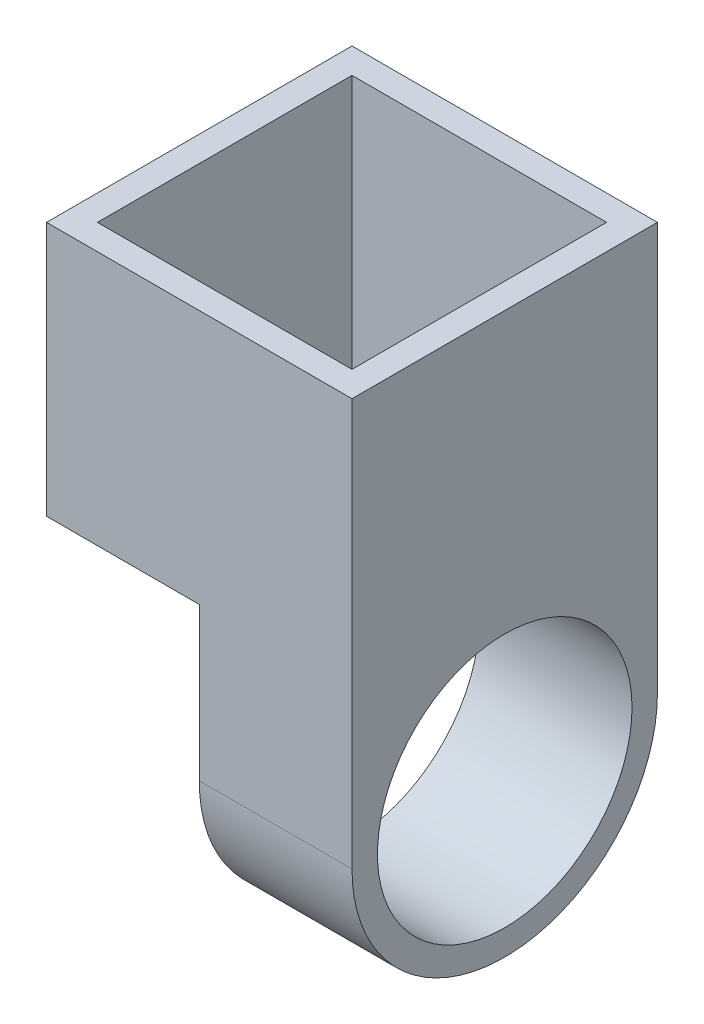
ISO-10303-21;
HEADER;
FILE_DESCRIPTION(('STEP AP214'),'2;1');
FILE_NAME('part.step','',(''),(''),'','','');
FILE_SCHEMA(('AUTOMOTIVE_DESIGN { 1 0 10303 214 1 1 1 1 }'));
ENDSEC;
DATA;
#1=APPLICATION_CONTEXT('core data for automotive mechanical design processes');
#2=APPLICATION_PROTOCOL_DEFINITION('international standard','automotive_design',2000,#1);
#3=PRODUCT_CONTEXT('',#1,'mechanical');
#4=PRODUCT('Part','Part','',(#3));
#5=PRODUCT_RELATED_PRODUCT_CATEGORY('part','',(#4));
#6=PRODUCT_DEFINITION_FORMATION('','',#4);
#7=PRODUCT_DEFINITION_CONTEXT('part definition',#1,'design');
#8=PRODUCT_DEFINITION('design','',#6,#7);
#9=PRODUCT_DEFINITION_SHAPE('','',#8);
#10=(LENGTH_UNIT() NAMED_UNIT(*) SI_UNIT(.MILLI.,.METRE.));
#11=(NAMED_UNIT(*) PLANE_ANGLE_UNIT() SI_UNIT($,.RADIAN.));
#12=(NAMED_UNIT(*) SI_UNIT($,.STERADIAN.) SOLID_ANGLE_UNIT());
#13=UNCERTAINTY_MEASURE_WITH_UNIT(LENGTH_MEASURE(1.E-05),#10,'distance_accuracy_value','');
#14=(GEOMETRIC_REPRESENTATION_CONTEXT(3) GLOBAL_UNCERTAINTY_ASSIGNED_CONTEXT((#13)) GLOBAL_UNIT_ASSIGNED_CONTEXT((#10,
#11,#12)) REPRESENTATION_CONTEXT('',''));
#15=CARTESIAN_POINT('',(0.,0.,0.));
#16=DIRECTION('',(0.,0.,1.));
#17=DIRECTION('',(1.,0.,0.));
#18=AXIS2_PLACEMENT_3D('',#15,#16,#17);
#19=CARTESIAN_POINT('',(0.,0.,0.));
#20=DIRECTION('',(0.,1.,0.));
#21=DIRECTION('',(0.,0.,1.));
#22=AXIS2_PLACEMENT_3D('',#19,#20,#21);
#23=PLANE('',#22);
#24=DIRECTION('',(0.,0.,-1.));
#25=VECTOR('',#24,1.);
#26=CARTESIAN_POINT('',(0.,0.,0.));
#27=LINE('',#26,#25);
#28=CARTESIAN_POINT('',(0.,0.,6.));
#29=VERTEX_POINT('',#28);
#30=CARTESIAN_POINT('',(0.,0.,5.));
#31=VERTEX_POINT('',#30);
#32=EDGE_CURVE('E50',#29,#31,#27,.T.);
#33=ORIENTED_EDGE('',*,*,#32,.F.);
#34=DIRECTION('',(1.,0.,0.));
#35=VECTOR('',#34,1.);
#36=CARTESIAN_POINT('',(-6.,0.,6.));
#37=LINE('',#36,#35);
#38=CARTESIAN_POINT('',(-6.,0.,6.));
#39=VERTEX_POINT('',#38);
#40=EDGE_CURVE('E195',#39,#29,#37,.T.);
#41=ORIENTED_EDGE('',*,*,#40,.F.);
#42=DIRECTION('',(0.,0.,1.));
#43=VECTOR('',#42,1.);
#44=CARTESIAN_POINT('',(-6.,0.,-6.));
#45=LINE('',#44,#43);
#46=CARTESIAN_POINT('',(-6.,0.,-6.));
#47=VERTEX_POINT('',#46);
#48=EDGE_CURVE('E203',#47,#39,#45,.T.);
#49=ORIENTED_EDGE('',*,*,#48,.F.);
#50=DIRECTION('',(-1.,0.,0.));
#51=VECTOR('',#50,1.);
#52=CARTESIAN_POINT('',(-6.,0.,-6.));
#53=LINE('',#52,#51);
#54=CARTESIAN_POINT('',(0.,0.,-6.));
#55=VERTEX_POINT('',#54);
#56=EDGE_CURVE('E190',#55,#47,#53,.T.);
#57=ORIENTED_EDGE('',*,*,#56,.F.);
#58=CARTESIAN_POINT('',(0.,0.,-5.));
#59=VERTEX_POINT('',#58);
#60=EDGE_CURVE('E11',#59,#55,#27,.T.);
#61=ORIENTED_EDGE('',*,*,#60,.F.);
#62=DIRECTION('',(-1.,0.,0.));
#63=VECTOR('',#62,1.);
#64=CARTESIAN_POINT('',(-5.,0.,-5.));
#65=LINE('',#64,#63);
#66=CARTESIAN_POINT('',(-5.,0.,-5.));
#67=VERTEX_POINT('',#66);
#68=EDGE_CURVE('E173',#59,#67,#65,.T.);
#69=ORIENTED_EDGE('',*,*,#68,.T.);
#70=DIRECTION('',(0.,0.,1.));
#71=VECTOR('',#70,1.);
#72=CARTESIAN_POINT('',(-5.,0.,-5.));
#73=LINE('',#72,#71);
#74=CARTESIAN_POINT('',(-5.,0.,5.));
#75=VERTEX_POINT('',#74);
#76=EDGE_CURVE('E177',#67,#75,#73,.T.);
#77=ORIENTED_EDGE('',*,*,#76,.T.);
#78=DIRECTION('',(1.,0.,0.));
#79=VECTOR('',#78,1.);
#80=CARTESIAN_POINT('',(-5.,0.,5.));
#81=LINE('',#80,#79);
#82=EDGE_CURVE('E163',#75,#31,#81,.T.);
#83=ORIENTED_EDGE('',*,*,#82,.T.);
#84=EDGE_LOOP('',(#33,#41,#49,#57,#61,#69,#77,#83));
#85=FACE_BOUND('',#84,.T.);
#86=ADVANCED_FACE('F40',(#85),#23,.F.);
#87=CARTESIAN_POINT('',(0.,10.,0.));
#88=DIRECTION('',(0.,1.,0.));
#89=DIRECTION('',(0.,0.,1.));
#90=AXIS2_PLACEMENT_3D('',#87,#88,#89);
#91=PLANE('',#90);
#92=DIRECTION('',(0.,0.,-1.));
#93=VECTOR('',#92,1.);
#94=CARTESIAN_POINT('',(6.,10.,-6.));
#95=LINE('',#94,#93);
#96=CARTESIAN_POINT('',(6.,10.,6.));
#97=VERTEX_POINT('',#96);
#98=CARTESIAN_POINT('',(6.,10.,-6.));
#99=VERTEX_POINT('',#98);
#100=EDGE_CURVE('E191',#97,#99,#95,.T.);
#101=ORIENTED_EDGE('',*,*,#100,.T.);
#102=DIRECTION('',(-1.,0.,0.));
#103=VECTOR('',#102,1.);
#104=CARTESIAN_POINT('',(-6.,10.,-6.));
#105=LINE('',#104,#103);
#106=CARTESIAN_POINT('',(-6.,10.,-6.));
#107=VERTEX_POINT('',#106);
#108=EDGE_CURVE('E194',#99,#107,#105,.T.);
#109=ORIENTED_EDGE('',*,*,#108,.T.);
#110=DIRECTION('',(0.,0.,1.));
#111=VECTOR('',#110,1.);
#112=CARTESIAN_POINT('',(-6.,10.,-6.));
#113=LINE('',#112,#111);
#114=CARTESIAN_POINT('',(-6.,10.,6.));
#115=VERTEX_POINT('',#114);
#116=EDGE_CURVE('E197',#107,#115,#113,.T.);
#117=ORIENTED_EDGE('',*,*,#116,.T.);
#118=DIRECTION('',(1.,0.,0.));
#119=VECTOR('',#118,1.);
#120=CARTESIAN_POINT('',(-6.,10.,6.));
#121=LINE('',#120,#119);
#122=EDGE_CURVE('E199',#115,#97,#121,.T.);
#123=ORIENTED_EDGE('',*,*,#122,.T.);
#124=EDGE_LOOP('',(#101,#109,#117,#123));
#125=FACE_BOUND('',#124,.T.);
#126=DIRECTION('',(-1.,0.,0.));
#127=VECTOR('',#126,1.);
#128=CARTESIAN_POINT('',(-5.,10.,-5.));
#129=LINE('',#128,#127);
#130=CARTESIAN_POINT('',(5.,10.,-5.));
#131=VERTEX_POINT('',#130);
#132=CARTESIAN_POINT('',(-5.,10.,-5.));
#133=VERTEX_POINT('',#132);
#134=EDGE_CURVE('E162',#131,#133,#129,.T.);
#135=ORIENTED_EDGE('',*,*,#134,.F.);
#136=DIRECTION('',(0.,0.,-1.));
#137=VECTOR('',#136,1.);
#138=CARTESIAN_POINT('',(5.,10.,-5.));
#139=LINE('',#138,#137);
#140=CARTESIAN_POINT('',(5.,10.,5.));
#141=VERTEX_POINT('',#140);
#142=EDGE_CURVE('E160',#141,#131,#139,.T.);
#143=ORIENTED_EDGE('',*,*,#142,.F.);
#144=DIRECTION('',(1.,0.,0.));
#145=VECTOR('',#144,1.);
#146=CARTESIAN_POINT('',(-5.,10.,5.));
#147=LINE('',#146,#145);
#148=CARTESIAN_POINT('',(-5.,10.,5.));
#149=VERTEX_POINT('',#148);
#150=EDGE_CURVE('E168',#149,#141,#147,.T.);
#151=ORIENTED_EDGE('',*,*,#150,.F.);
#152=DIRECTION('',(0.,0.,1.));
#153=VECTOR('',#152,1.);
#154=CARTESIAN_POINT('',(-5.,10.,-5.));
#155=LINE('',#154,#153);
#156=EDGE_CURVE('E165',#133,#149,#155,.T.);
#157=ORIENTED_EDGE('',*,*,#156,.F.);
#158=EDGE_LOOP('',(#135,#143,#151,#157));
#159=FACE_BOUND('',#158,.T.);
#160=ADVANCED_FACE('F235',(#125,#159),#91,.T.);
#161=CARTESIAN_POINT('',(6.,10.,-6.));
#162=DIRECTION('',(-1.,0.,0.));
#163=DIRECTION('',(0.,0.,1.));
#164=AXIS2_PLACEMENT_3D('',#161,#162,#163);
#165=PLANE('',#164);
#166=CARTESIAN_POINT('',(6.,-6.,0.));
#167=DIRECTION('',(1.,0.,0.));
#168=DIRECTION('',(0.,0.,-1.));
#169=AXIS2_PLACEMENT_3D('',#166,#167,#168);
#170=CIRCLE('',#169,5.);
#171=CARTESIAN_POINT('',(6.,-6.,-5.));
#172=VERTEX_POINT('',#171);
#173=EDGE_CURVE('E153',#172,#172,#170,.T.);
#174=ORIENTED_EDGE('',*,*,#173,.F.);
#175=EDGE_LOOP('',(#174));
#176=FACE_BOUND('',#175,.T.);
#177=DIRECTION('',(0.,-1.,0.));
#178=VECTOR('',#177,1.);
#179=CARTESIAN_POINT('',(6.,10.,6.));
#180=LINE('',#179,#178);
#181=CARTESIAN_POINT('',(6.,-6.,6.));
#182=VERTEX_POINT('',#181);
#183=EDGE_CURVE('E201',#97,#182,#180,.T.);
#184=ORIENTED_EDGE('',*,*,#183,.T.);
#185=CARTESIAN_POINT('',(6.,-6.,0.));
#186=DIRECTION('',(1.,0.,0.));
#187=DIRECTION('',(0.,0.,-1.));
#188=AXIS2_PLACEMENT_3D('',#185,#186,#187);
#189=CIRCLE('',#188,6.);
#190=CARTESIAN_POINT('',(6.,-6.,-6.));
#191=VERTEX_POINT('',#190);
#192=EDGE_CURVE('E148',#182,#191,#189,.T.);
#193=ORIENTED_EDGE('',*,*,#192,.T.);
#194=DIRECTION('',(0.,-1.,0.));
#195=VECTOR('',#194,1.);
#196=CARTESIAN_POINT('',(6.,10.,-6.));
#197=LINE('',#196,#195);
#198=EDGE_CURVE('E44',#99,#191,#197,.T.);
#199=ORIENTED_EDGE('',*,*,#198,.F.);
#200=ORIENTED_EDGE('',*,*,#100,.F.);
#201=EDGE_LOOP('',(#184,#193,#199,#200));
#202=FACE_BOUND('',#201,.T.);
#203=ADVANCED_FACE('F42',(#176,#202),#165,.F.);
#204=CARTESIAN_POINT('',(-6.,10.,-6.));
#205=DIRECTION('',(0.,0.,1.));
#206=DIRECTION('',(1.,0.,0.));
#207=AXIS2_PLACEMENT_3D('',#204,#205,#206);
#208=PLANE('',#207);
#209=ORIENTED_EDGE('',*,*,#198,.T.);
#210=DIRECTION('',(1.,0.,0.));
#211=VECTOR('',#210,1.);
#212=CARTESIAN_POINT('',(0.,-6.,-6.));
#213=LINE('',#212,#211);
#214=CARTESIAN_POINT('',(0.,-6.,-6.));
#215=VERTEX_POINT('',#214);
#216=EDGE_CURVE('E136',#215,#191,#213,.T.);
#217=ORIENTED_EDGE('',*,*,#216,.F.);
#218=DIRECTION('',(0.,-1.,0.));
#219=VECTOR('',#218,1.);
#220=CARTESIAN_POINT('',(0.,0.,-6.));
#221=LINE('',#220,#219);
#222=EDGE_CURVE('E126',#55,#215,#221,.T.);
#223=ORIENTED_EDGE('',*,*,#222,.F.);
#224=ORIENTED_EDGE('',*,*,#56,.T.);
#225=DIRECTION('',(0.,-1.,0.));
#226=VECTOR('',#225,1.);
#227=CARTESIAN_POINT('',(-6.,10.,-6.));
#228=LINE('',#227,#226);
#229=EDGE_CURVE('E210',#107,#47,#228,.T.);
#230=ORIENTED_EDGE('',*,*,#229,.F.);
#231=ORIENTED_EDGE('',*,*,#108,.F.);
#232=EDGE_LOOP('',(#209,#217,#223,#224,#230,#231));
#233=FACE_BOUND('',#232,.T.);
#234=ADVANCED_FACE('F137',(#233),#208,.F.);
#235=CARTESIAN_POINT('',(-6.,10.,-6.));
#236=DIRECTION('',(1.,0.,0.));
#237=DIRECTION('',(0.,0.,-1.));
#238=AXIS2_PLACEMENT_3D('',#235,#236,#237);
#239=PLANE('',#238);
#240=ORIENTED_EDGE('',*,*,#48,.T.);
#241=DIRECTION('',(0.,-1.,0.));
#242=VECTOR('',#241,1.);
#243=CARTESIAN_POINT('',(-6.,10.,6.));
#244=LINE('',#243,#242);
#245=EDGE_CURVE('E208',#115,#39,#244,.T.);
#246=ORIENTED_EDGE('',*,*,#245,.F.);
#247=ORIENTED_EDGE('',*,*,#116,.F.);
#248=ORIENTED_EDGE('',*,*,#229,.T.);
#249=EDGE_LOOP('',(#240,#246,#247,#248));
#250=FACE_BOUND('',#249,.T.);
#251=ADVANCED_FACE('F216',(#250),#239,.F.);
#252=CARTESIAN_POINT('',(-6.,10.,6.));
#253=DIRECTION('',(0.,0.,-1.));
#254=DIRECTION('',(-1.,0.,0.));
#255=AXIS2_PLACEMENT_3D('',#252,#253,#254);
#256=PLANE('',#255);
#257=ORIENTED_EDGE('',*,*,#40,.T.);
#258=DIRECTION('',(0.,1.,0.));
#259=VECTOR('',#258,1.);
#260=CARTESIAN_POINT('',(0.,0.,6.));
#261=LINE('',#260,#259);
#262=CARTESIAN_POINT('',(0.,-6.,6.));
#263=VERTEX_POINT('',#262);
#264=EDGE_CURVE('E143',#263,#29,#261,.T.);
#265=ORIENTED_EDGE('',*,*,#264,.F.);
#266=DIRECTION('',(1.,0.,0.));
#267=VECTOR('',#266,1.);
#268=CARTESIAN_POINT('',(0.,-6.,6.));
#269=LINE('',#268,#267);
#270=EDGE_CURVE('E142',#263,#182,#269,.T.);
#271=ORIENTED_EDGE('',*,*,#270,.T.);
#272=ORIENTED_EDGE('',*,*,#183,.F.);
#273=ORIENTED_EDGE('',*,*,#122,.F.);
#274=ORIENTED_EDGE('',*,*,#245,.T.);
#275=EDGE_LOOP('',(#257,#265,#271,#272,#273,#274));
#276=FACE_BOUND('',#275,.T.);
#277=ADVANCED_FACE('F220',(#276),#256,.F.);
#278=CARTESIAN_POINT('',(5.,10.,-5.));
#279=DIRECTION('',(-1.,0.,0.));
#280=DIRECTION('',(0.,0.,1.));
#281=AXIS2_PLACEMENT_3D('',#278,#279,#280);
#282=PLANE('',#281);
#283=DIRECTION('',(0.,0.,-1.));
#284=VECTOR('',#283,1.);
#285=CARTESIAN_POINT('',(5.,0.,-5.));
#286=LINE('',#285,#284);
#287=CARTESIAN_POINT('',(5.,0.,5.));
#288=VERTEX_POINT('',#287);
#289=CARTESIAN_POINT('',(5.,0.,-5.));
#290=VERTEX_POINT('',#289);
#291=EDGE_CURVE('E158',#288,#290,#286,.T.);
#292=ORIENTED_EDGE('',*,*,#291,.F.);
#293=DIRECTION('',(0.,-1.,0.));
#294=VECTOR('',#293,1.);
#295=CARTESIAN_POINT('',(5.,10.,5.));
#296=LINE('',#295,#294);
#297=EDGE_CURVE('E170',#141,#288,#296,.T.);
#298=ORIENTED_EDGE('',*,*,#297,.F.);
#299=ORIENTED_EDGE('',*,*,#142,.T.);
#300=DIRECTION('',(0.,-1.,0.));
#301=VECTOR('',#300,1.);
#302=CARTESIAN_POINT('',(5.,10.,-5.));
#303=LINE('',#302,#301);
#304=EDGE_CURVE('E187',#131,#290,#303,.T.);
#305=ORIENTED_EDGE('',*,*,#304,.T.);
#306=EDGE_LOOP('',(#292,#298,#299,#305));
#307=FACE_BOUND('',#306,.T.);
#308=ADVANCED_FACE('F230',(#307),#282,.T.);
#309=CARTESIAN_POINT('',(-5.,10.,-5.));
#310=DIRECTION('',(0.,0.,1.));
#311=DIRECTION('',(1.,0.,0.));
#312=AXIS2_PLACEMENT_3D('',#309,#310,#311);
#313=PLANE('',#312);
#314=EDGE_CURVE('E174',#290,#59,#65,.T.);
#315=ORIENTED_EDGE('',*,*,#314,.F.);
#316=ORIENTED_EDGE('',*,*,#304,.F.);
#317=ORIENTED_EDGE('',*,*,#134,.T.);
#318=DIRECTION('',(0.,-1.,0.));
#319=VECTOR('',#318,1.);
#320=CARTESIAN_POINT('',(-5.,10.,-5.));
#321=LINE('',#320,#319);
#322=EDGE_CURVE('E184',#133,#67,#321,.T.);
#323=ORIENTED_EDGE('',*,*,#322,.T.);
#324=ORIENTED_EDGE('',*,*,#68,.F.);
#325=EDGE_LOOP('',(#315,#316,#317,#323,#324));
#326=FACE_BOUND('',#325,.T.);
#327=ADVANCED_FACE('F227',(#326),#313,.T.);
#328=CARTESIAN_POINT('',(-5.,10.,-5.));
#329=DIRECTION('',(1.,0.,0.));
#330=DIRECTION('',(0.,0.,-1.));
#331=AXIS2_PLACEMENT_3D('',#328,#329,#330);
#332=PLANE('',#331);
#333=ORIENTED_EDGE('',*,*,#76,.F.);
#334=ORIENTED_EDGE('',*,*,#322,.F.);
#335=ORIENTED_EDGE('',*,*,#156,.T.);
#336=DIRECTION('',(0.,-1.,0.));
#337=VECTOR('',#336,1.);
#338=CARTESIAN_POINT('',(-5.,10.,5.));
#339=LINE('',#338,#337);
#340=EDGE_CURVE('E182',#149,#75,#339,.T.);
#341=ORIENTED_EDGE('',*,*,#340,.T.);
#342=EDGE_LOOP('',(#333,#334,#335,#341));
#343=FACE_BOUND('',#342,.T.);
#344=ADVANCED_FACE('F240',(#343),#332,.T.);
#345=CARTESIAN_POINT('',(-5.,10.,5.));
#346=DIRECTION('',(0.,0.,-1.));
#347=DIRECTION('',(-1.,0.,0.));
#348=AXIS2_PLACEMENT_3D('',#345,#346,#347);
#349=PLANE('',#348);
#350=ORIENTED_EDGE('',*,*,#82,.F.);
#351=ORIENTED_EDGE('',*,*,#340,.F.);
#352=ORIENTED_EDGE('',*,*,#150,.T.);
#353=ORIENTED_EDGE('',*,*,#297,.T.);
#354=EDGE_CURVE('E58',#31,#288,#81,.T.);
#355=ORIENTED_EDGE('',*,*,#354,.F.);
#356=EDGE_LOOP('',(#350,#351,#352,#353,#355));
#357=FACE_BOUND('',#356,.T.);
#358=ADVANCED_FACE('F241',(#357),#349,.T.);
#359=CARTESIAN_POINT('',(0.,0.,0.));
#360=DIRECTION('',(0.,-1.,0.));
#361=DIRECTION('',(0.,0.,-1.));
#362=AXIS2_PLACEMENT_3D('',#359,#360,#361);
#363=PLANE('',#362);
#364=ORIENTED_EDGE('',*,*,#291,.T.);
#365=ORIENTED_EDGE('',*,*,#314,.T.);
#366=EDGE_CURVE('E51',#31,#59,#27,.T.);
#367=ORIENTED_EDGE('',*,*,#366,.F.);
#368=ORIENTED_EDGE('',*,*,#354,.T.);
#369=EDGE_LOOP('',(#364,#365,#367,#368));
#370=FACE_BOUND('',#369,.T.);
#371=ADVANCED_FACE('F224',(#370),#363,.F.);
#372=CARTESIAN_POINT('',(0.,-6.,0.));
#373=DIRECTION('',(1.,0.,0.));
#374=DIRECTION('',(0.,0.,-1.));
#375=AXIS2_PLACEMENT_3D('',#372,#373,#374);
#376=CYLINDRICAL_SURFACE('',#375,6.);
#377=ORIENTED_EDGE('',*,*,#192,.F.);
#378=ORIENTED_EDGE('',*,*,#270,.F.);
#379=CARTESIAN_POINT('',(0.,-6.,0.));
#380=DIRECTION('',(1.,0.,0.));
#381=DIRECTION('',(0.,0.,-1.));
#382=AXIS2_PLACEMENT_3D('',#379,#380,#381);
#383=CIRCLE('',#382,6.);
#384=EDGE_CURVE('E131',#263,#215,#383,.T.);
#385=ORIENTED_EDGE('',*,*,#384,.T.);
#386=ORIENTED_EDGE('',*,*,#216,.T.);
#387=EDGE_LOOP('',(#377,#378,#385,#386));
#388=FACE_BOUND('',#387,.T.);
#389=ADVANCED_FACE('F145',(#388),#376,.T.);
#390=CARTESIAN_POINT('',(0.,0.,0.));
#391=DIRECTION('',(1.,0.,0.));
#392=DIRECTION('',(0.,0.,-1.));
#393=AXIS2_PLACEMENT_3D('',#390,#391,#392);
#394=PLANE('',#393);
#395=CARTESIAN_POINT('',(0.,-6.,0.));
#396=DIRECTION('',(1.,0.,0.));
#397=DIRECTION('',(0.,0.,-1.));
#398=AXIS2_PLACEMENT_3D('',#395,#396,#397);
#399=CIRCLE('',#398,5.);
#400=CARTESIAN_POINT('',(0.,-6.,-5.));
#401=VERTEX_POINT('',#400);
#402=EDGE_CURVE('E150',#401,#401,#399,.T.);
#403=ORIENTED_EDGE('',*,*,#402,.T.);
#404=EDGE_LOOP('',(#403));
#405=FACE_BOUND('',#404,.T.);
#406=ORIENTED_EDGE('',*,*,#384,.F.);
#407=ORIENTED_EDGE('',*,*,#264,.T.);
#408=ORIENTED_EDGE('',*,*,#32,.T.);
#409=ORIENTED_EDGE('',*,*,#366,.T.);
#410=ORIENTED_EDGE('',*,*,#60,.T.);
#411=ORIENTED_EDGE('',*,*,#222,.T.);
#412=EDGE_LOOP('',(#406,#407,#408,#409,#410,#411));
#413=FACE_BOUND('',#412,.T.);
#414=ADVANCED_FACE('F128',(#405,#413),#394,.F.);
#415=CARTESIAN_POINT('',(0.,-6.,0.));
#416=DIRECTION('',(1.,0.,0.));
#417=DIRECTION('',(0.,0.,-1.));
#418=AXIS2_PLACEMENT_3D('',#415,#416,#417);
#419=CYLINDRICAL_SURFACE('',#418,5.);
#420=ORIENTED_EDGE('',*,*,#402,.F.);
#421=EDGE_LOOP('',(#420));
#422=FACE_BOUND('',#421,.T.);
#423=ORIENTED_EDGE('',*,*,#173,.T.);
#424=EDGE_LOOP('',(#423));
#425=FACE_BOUND('',#424,.T.);
#426=ADVANCED_FACE('F280',(#422,#425),#419,.F.);
#427=CLOSED_SHELL('',(#86,#160,#203,#234,#251,#277,#308,#327,#344,#358,#371,#389,#414,#426));
#428=MANIFOLD_SOLID_BREP('B2',#427);
#429=ADVANCED_BREP_SHAPE_REPRESENTATION('',(#18,#428),#14);
#430=SHAPE_DEFINITION_REPRESENTATION(#9,#429);
ENDSEC;
END-ISO-10303-21;
